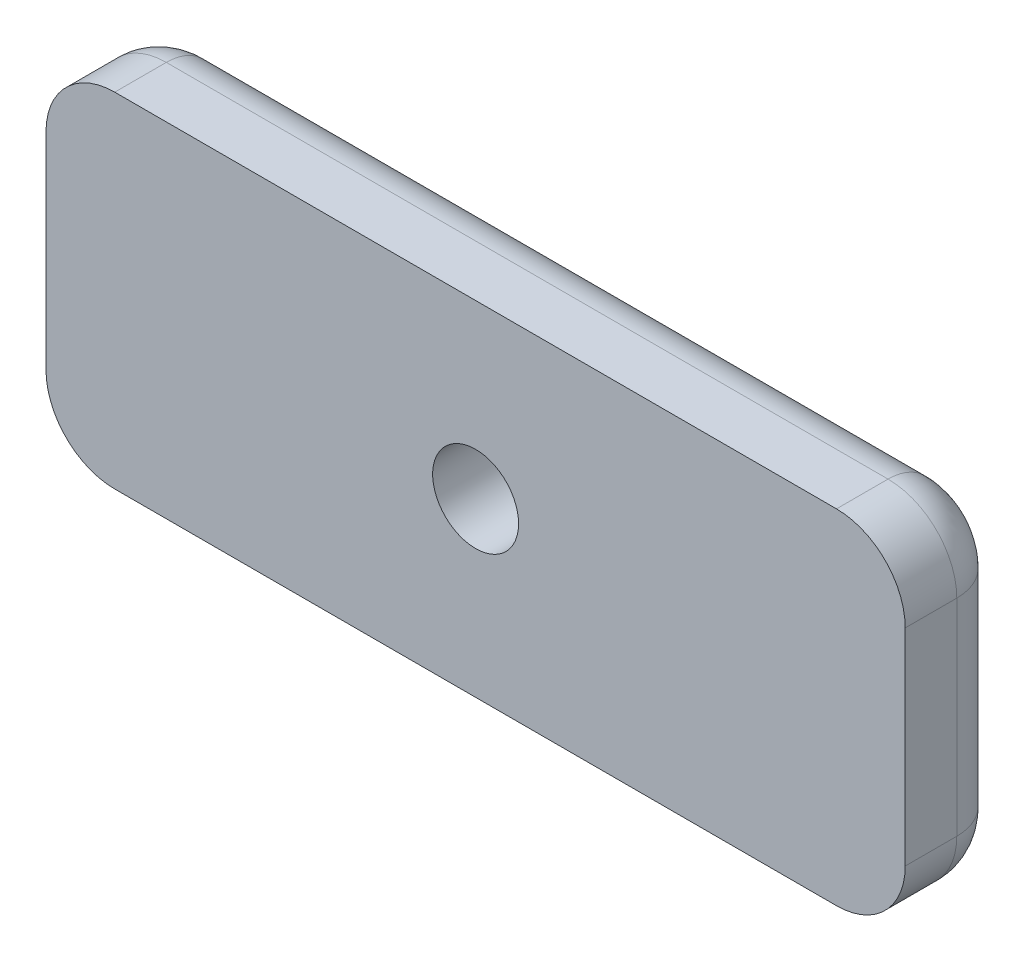
ISO-10303-21;
HEADER;
FILE_DESCRIPTION(('STEP AP214'),'2;1');
FILE_NAME('part.step','',(''),(''),'','','');
FILE_SCHEMA(('AUTOMOTIVE_DESIGN { 1 0 10303 214 1 1 1 1 }'));
ENDSEC;
DATA;
#1=APPLICATION_CONTEXT('core data for automotive mechanical design processes');
#2=APPLICATION_PROTOCOL_DEFINITION('international standard','automotive_design',2000,#1);
#3=PRODUCT_CONTEXT('',#1,'mechanical');
#4=PRODUCT('Part','Part','',(#3));
#5=PRODUCT_RELATED_PRODUCT_CATEGORY('part','',(#4));
#6=PRODUCT_DEFINITION_FORMATION('','',#4);
#7=PRODUCT_DEFINITION_CONTEXT('part definition',#1,'design');
#8=PRODUCT_DEFINITION('design','',#6,#7);
#9=PRODUCT_DEFINITION_SHAPE('','',#8);
#10=(LENGTH_UNIT() NAMED_UNIT(*) SI_UNIT(.MILLI.,.METRE.));
#11=(NAMED_UNIT(*) PLANE_ANGLE_UNIT() SI_UNIT($,.RADIAN.));
#12=(NAMED_UNIT(*) SI_UNIT($,.STERADIAN.) SOLID_ANGLE_UNIT());
#13=UNCERTAINTY_MEASURE_WITH_UNIT(LENGTH_MEASURE(1.E-05),#10,'distance_accuracy_value','');
#14=(GEOMETRIC_REPRESENTATION_CONTEXT(3) GLOBAL_UNCERTAINTY_ASSIGNED_CONTEXT((#13)) GLOBAL_UNIT_ASSIGNED_CONTEXT((#10,
#11,#12)) REPRESENTATION_CONTEXT('',''));
#15=CARTESIAN_POINT('',(0.,0.,0.));
#16=DIRECTION('',(0.,0.,1.));
#17=DIRECTION('',(1.,0.,0.));
#18=AXIS2_PLACEMENT_3D('',#15,#16,#17);
#19=CARTESIAN_POINT('',(21.,7.58418091123838,6.));
#20=DIRECTION('',(0.,0.,-1.));
#21=DIRECTION('',(-1.,0.,0.));
#22=AXIS2_PLACEMENT_3D('',#19,#20,#21);
#23=PLANE('',#22);
#24=CARTESIAN_POINT('',(21.,7.58418091123838,6.));
#25=DIRECTION('',(0.,0.,1.));
#26=DIRECTION('',(-1.,0.,0.));
#27=AXIS2_PLACEMENT_3D('',#24,#25,#26);
#28=CIRCLE('',#27,4.);
#29=CARTESIAN_POINT('',(25.,7.58418091123838,6.));
#30=VERTEX_POINT('',#29);
#31=CARTESIAN_POINT('',(21.,11.5841809112384,6.));
#32=VERTEX_POINT('',#31);
#33=EDGE_CURVE('E137',#30,#32,#28,.T.);
#34=ORIENTED_EDGE('',*,*,#33,.T.);
#35=DIRECTION('',(-1.,0.,0.));
#36=VECTOR('',#35,1.);
#37=CARTESIAN_POINT('',(-21.,11.5841809112384,6.));
#38=LINE('',#37,#36);
#39=CARTESIAN_POINT('',(-21.,11.5841809112384,6.));
#40=VERTEX_POINT('',#39);
#41=EDGE_CURVE('E127',#32,#40,#38,.T.);
#42=ORIENTED_EDGE('',*,*,#41,.T.);
#43=CARTESIAN_POINT('',(-21.,7.58418091123838,6.));
#44=DIRECTION('',(0.,0.,1.));
#45=DIRECTION('',(1.,0.,0.));
#46=AXIS2_PLACEMENT_3D('',#43,#44,#45);
#47=CIRCLE('',#46,4.);
#48=CARTESIAN_POINT('',(-25.,7.58418091123838,6.));
#49=VERTEX_POINT('',#48);
#50=EDGE_CURVE('E136',#40,#49,#47,.T.);
#51=ORIENTED_EDGE('',*,*,#50,.T.);
#52=DIRECTION('',(0.,-1.,0.));
#53=VECTOR('',#52,1.);
#54=CARTESIAN_POINT('',(-25.,7.58418091123838,6.));
#55=LINE('',#54,#53);
#56=CARTESIAN_POINT('',(-25.,-4.41581908876162,6.));
#57=VERTEX_POINT('',#56);
#58=EDGE_CURVE('E216',#49,#57,#55,.T.);
#59=ORIENTED_EDGE('',*,*,#58,.T.);
#60=CARTESIAN_POINT('',(-21.,-4.41581908876162,6.));
#61=DIRECTION('',(0.,0.,1.));
#62=DIRECTION('',(1.,0.,0.));
#63=AXIS2_PLACEMENT_3D('',#60,#61,#62);
#64=CIRCLE('',#63,4.);
#65=CARTESIAN_POINT('',(-21.,-8.41581908876162,6.));
#66=VERTEX_POINT('',#65);
#67=EDGE_CURVE('E218',#57,#66,#64,.T.);
#68=ORIENTED_EDGE('',*,*,#67,.T.);
#69=DIRECTION('',(1.,0.,0.));
#70=VECTOR('',#69,1.);
#71=CARTESIAN_POINT('',(-21.,-8.41581908876162,6.));
#72=LINE('',#71,#70);
#73=CARTESIAN_POINT('',(21.,-8.41581908876162,6.));
#74=VERTEX_POINT('',#73);
#75=EDGE_CURVE('E220',#66,#74,#72,.T.);
#76=ORIENTED_EDGE('',*,*,#75,.T.);
#77=CARTESIAN_POINT('',(21.,-4.41581908876162,6.));
#78=DIRECTION('',(0.,0.,1.));
#79=DIRECTION('',(1.,0.,0.));
#80=AXIS2_PLACEMENT_3D('',#77,#78,#79);
#81=CIRCLE('',#80,4.);
#82=CARTESIAN_POINT('',(25.,-4.41581908876162,6.));
#83=VERTEX_POINT('',#82);
#84=EDGE_CURVE('E222',#74,#83,#81,.T.);
#85=ORIENTED_EDGE('',*,*,#84,.T.);
#86=DIRECTION('',(0.,1.,0.));
#87=VECTOR('',#86,1.);
#88=CARTESIAN_POINT('',(25.,7.58418091123838,6.));
#89=LINE('',#88,#87);
#90=EDGE_CURVE('E142',#83,#30,#89,.T.);
#91=ORIENTED_EDGE('',*,*,#90,.T.);
#92=EDGE_LOOP('',(#34,#42,#51,#59,#68,#76,#85,#91));
#93=FACE_BOUND('',#92,.T.);
#94=CARTESIAN_POINT('',(0.,1.58418091123838,6.));
#95=DIRECTION('',(0.,0.,1.));
#96=DIRECTION('',(1.,0.,0.));
#97=AXIS2_PLACEMENT_3D('',#94,#95,#96);
#98=CIRCLE('',#97,2.5);
#99=CARTESIAN_POINT('',(2.50000000000004,1.58418091123838,6.));
#100=VERTEX_POINT('',#99);
#101=EDGE_CURVE('E143',#100,#100,#98,.T.);
#102=ORIENTED_EDGE('',*,*,#101,.F.);
#103=EDGE_LOOP('',(#102));
#104=FACE_BOUND('',#103,.T.);
#105=ADVANCED_FACE('F37',(#93,#104),#23,.F.);
#106=CARTESIAN_POINT('',(21.,7.58418091123838,0.));
#107=DIRECTION('',(0.,0.,-1.));
#108=DIRECTION('',(-1.,0.,0.));
#109=AXIS2_PLACEMENT_3D('',#106,#107,#108);
#110=PLANE('',#109);
#111=DIRECTION('',(0.,1.,0.));
#112=VECTOR('',#111,1.);
#113=CARTESIAN_POINT('',(22.,-4.41581908876162,0.));
#114=LINE('',#113,#112);
#115=CARTESIAN_POINT('',(22.,7.58418091123838,0.));
#116=VERTEX_POINT('',#115);
#117=CARTESIAN_POINT('',(22.,-4.41581908876162,0.));
#118=VERTEX_POINT('',#117);
#119=EDGE_CURVE('E149',#116,#118,#114,.F.);
#120=ORIENTED_EDGE('',*,*,#119,.T.);
#121=CARTESIAN_POINT('',(21.,-4.41581908876162,0.));
#122=DIRECTION('',(0.,0.,-1.));
#123=DIRECTION('',(-1.,0.,0.));
#124=AXIS2_PLACEMENT_3D('',#121,#122,#123);
#125=CIRCLE('',#124,1.);
#126=CARTESIAN_POINT('',(21.,-5.41581908876162,0.));
#127=VERTEX_POINT('',#126);
#128=EDGE_CURVE('E168',#118,#127,#125,.T.);
#129=ORIENTED_EDGE('',*,*,#128,.T.);
#130=DIRECTION('',(1.,0.,0.));
#131=VECTOR('',#130,1.);
#132=CARTESIAN_POINT('',(-21.,-5.41581908876162,0.));
#133=LINE('',#132,#131);
#134=CARTESIAN_POINT('',(-21.,-5.41581908876162,0.));
#135=VERTEX_POINT('',#134);
#136=EDGE_CURVE('E166',#127,#135,#133,.F.);
#137=ORIENTED_EDGE('',*,*,#136,.T.);
#138=CARTESIAN_POINT('',(-21.,-4.41581908876162,0.));
#139=DIRECTION('',(0.,0.,-1.));
#140=DIRECTION('',(-1.,0.,0.));
#141=AXIS2_PLACEMENT_3D('',#138,#139,#140);
#142=CIRCLE('',#141,1.);
#143=CARTESIAN_POINT('',(-22.,-4.41581908876162,0.));
#144=VERTEX_POINT('',#143);
#145=EDGE_CURVE('E164',#135,#144,#142,.T.);
#146=ORIENTED_EDGE('',*,*,#145,.T.);
#147=DIRECTION('',(0.,-1.,0.));
#148=VECTOR('',#147,1.);
#149=CARTESIAN_POINT('',(-22.,7.58418091123838,0.));
#150=LINE('',#149,#148);
#151=CARTESIAN_POINT('',(-22.,7.58418091123838,0.));
#152=VERTEX_POINT('',#151);
#153=EDGE_CURVE('E162',#144,#152,#150,.F.);
#154=ORIENTED_EDGE('',*,*,#153,.T.);
#155=CARTESIAN_POINT('',(-21.,7.58418091123838,0.));
#156=DIRECTION('',(0.,0.,-1.));
#157=DIRECTION('',(-1.,0.,0.));
#158=AXIS2_PLACEMENT_3D('',#155,#156,#157);
#159=CIRCLE('',#158,0.999999999999999);
#160=CARTESIAN_POINT('',(-21.,8.58418091123838,0.));
#161=VERTEX_POINT('',#160);
#162=EDGE_CURVE('E160',#152,#161,#159,.T.);
#163=ORIENTED_EDGE('',*,*,#162,.T.);
#164=DIRECTION('',(-1.,0.,0.));
#165=VECTOR('',#164,1.);
#166=CARTESIAN_POINT('',(21.,8.58418091123838,0.));
#167=LINE('',#166,#165);
#168=CARTESIAN_POINT('',(21.,8.58418091123838,0.));
#169=VERTEX_POINT('',#168);
#170=EDGE_CURVE('E158',#161,#169,#167,.F.);
#171=ORIENTED_EDGE('',*,*,#170,.T.);
#172=CARTESIAN_POINT('',(21.,7.58418091123838,0.));
#173=DIRECTION('',(0.,0.,-1.));
#174=DIRECTION('',(-1.,0.,0.));
#175=AXIS2_PLACEMENT_3D('',#172,#173,#174);
#176=CIRCLE('',#175,0.999999999999998);
#177=EDGE_CURVE('E156',#169,#116,#176,.T.);
#178=ORIENTED_EDGE('',*,*,#177,.T.);
#179=EDGE_LOOP('',(#120,#129,#137,#146,#154,#163,#171,#178));
#180=FACE_BOUND('',#179,.T.);
#181=CARTESIAN_POINT('',(0.,1.58418091123838,0.));
#182=DIRECTION('',(0.,0.,1.));
#183=DIRECTION('',(1.,0.,0.));
#184=AXIS2_PLACEMENT_3D('',#181,#182,#183);
#185=CIRCLE('',#184,2.5);
#186=CARTESIAN_POINT('',(2.50000000000004,1.58418091123838,0.));
#187=VERTEX_POINT('',#186);
#188=EDGE_CURVE('E203',#187,#187,#185,.T.);
#189=ORIENTED_EDGE('',*,*,#188,.T.);
#190=EDGE_LOOP('',(#189));
#191=FACE_BOUND('',#190,.T.);
#192=ADVANCED_FACE('F275',(#180,#191),#110,.T.);
#193=CARTESIAN_POINT('',(21.,7.58418091123838,6.));
#194=DIRECTION('',(0.,0.,-1.));
#195=DIRECTION('',(-1.,0.,0.));
#196=AXIS2_PLACEMENT_3D('',#193,#194,#195);
#197=CYLINDRICAL_SURFACE('',#196,4.);
#198=DIRECTION('',(0.,0.,-1.));
#199=VECTOR('',#198,1.);
#200=CARTESIAN_POINT('',(25.,7.58418091123838,6.));
#201=LINE('',#200,#199);
#202=CARTESIAN_POINT('',(25.,7.58418091123838,3.));
#203=VERTEX_POINT('',#202);
#204=EDGE_CURVE('E225',#30,#203,#201,.T.);
#205=ORIENTED_EDGE('',*,*,#204,.T.);
#206=CARTESIAN_POINT('',(21.,7.58418091123838,3.));
#207=DIRECTION('',(0.,0.,-1.));
#208=DIRECTION('',(-1.,0.,0.));
#209=AXIS2_PLACEMENT_3D('',#206,#207,#208);
#210=CIRCLE('',#209,4.);
#211=CARTESIAN_POINT('',(21.,11.5841809112384,3.));
#212=VERTEX_POINT('',#211);
#213=EDGE_CURVE('E46',#203,#212,#210,.F.);
#214=ORIENTED_EDGE('',*,*,#213,.T.);
#215=DIRECTION('',(0.,0.,-1.));
#216=VECTOR('',#215,1.);
#217=CARTESIAN_POINT('',(21.,11.5841809112384,6.));
#218=LINE('',#217,#216);
#219=EDGE_CURVE('E130',#32,#212,#218,.T.);
#220=ORIENTED_EDGE('',*,*,#219,.F.);
#221=ORIENTED_EDGE('',*,*,#33,.F.);
#222=EDGE_LOOP('',(#205,#214,#220,#221));
#223=FACE_BOUND('',#222,.T.);
#224=ADVANCED_FACE('F145',(#223),#197,.T.);
#225=CARTESIAN_POINT('',(-21.,11.5841809112384,6.));
#226=DIRECTION('',(0.,-1.,0.));
#227=DIRECTION('',(1.,0.,0.));
#228=AXIS2_PLACEMENT_3D('',#225,#226,#227);
#229=PLANE('',#228);
#230=ORIENTED_EDGE('',*,*,#219,.T.);
#231=DIRECTION('',(-1.,0.,0.));
#232=VECTOR('',#231,1.);
#233=CARTESIAN_POINT('',(-21.,11.5841809112384,3.));
#234=LINE('',#233,#232);
#235=CARTESIAN_POINT('',(-21.,11.5841809112384,3.));
#236=VERTEX_POINT('',#235);
#237=EDGE_CURVE('E179',#212,#236,#234,.T.);
#238=ORIENTED_EDGE('',*,*,#237,.T.);
#239=DIRECTION('',(0.,0.,-1.));
#240=VECTOR('',#239,1.);
#241=CARTESIAN_POINT('',(-21.,11.5841809112384,6.));
#242=LINE('',#241,#240);
#243=EDGE_CURVE('E133',#40,#236,#242,.T.);
#244=ORIENTED_EDGE('',*,*,#243,.F.);
#245=ORIENTED_EDGE('',*,*,#41,.F.);
#246=EDGE_LOOP('',(#230,#238,#244,#245));
#247=FACE_BOUND('',#246,.T.);
#248=ADVANCED_FACE('F129',(#247),#229,.F.);
#249=CARTESIAN_POINT('',(-21.,7.58418091123838,6.));
#250=DIRECTION('',(0.,0.,-1.));
#251=DIRECTION('',(-1.,0.,0.));
#252=AXIS2_PLACEMENT_3D('',#249,#250,#251);
#253=CYLINDRICAL_SURFACE('',#252,4.);
#254=ORIENTED_EDGE('',*,*,#243,.T.);
#255=CARTESIAN_POINT('',(-21.,7.58418091123838,3.));
#256=DIRECTION('',(0.,0.,-1.));
#257=DIRECTION('',(-1.,0.,0.));
#258=AXIS2_PLACEMENT_3D('',#255,#256,#257);
#259=CIRCLE('',#258,4.);
#260=CARTESIAN_POINT('',(-25.,7.58418091123838,3.));
#261=VERTEX_POINT('',#260);
#262=EDGE_CURVE('E177',#236,#261,#259,.F.);
#263=ORIENTED_EDGE('',*,*,#262,.T.);
#264=DIRECTION('',(0.,0.,-1.));
#265=VECTOR('',#264,1.);
#266=CARTESIAN_POINT('',(-25.,7.58418091123838,6.));
#267=LINE('',#266,#265);
#268=EDGE_CURVE('E151',#49,#261,#267,.T.);
#269=ORIENTED_EDGE('',*,*,#268,.F.);
#270=ORIENTED_EDGE('',*,*,#50,.F.);
#271=EDGE_LOOP('',(#254,#263,#269,#270));
#272=FACE_BOUND('',#271,.T.);
#273=ADVANCED_FACE('F265',(#272),#253,.T.);
#274=CARTESIAN_POINT('',(-25.,7.58418091123838,6.));
#275=DIRECTION('',(1.,0.,0.));
#276=DIRECTION('',(0.,0.,-1.));
#277=AXIS2_PLACEMENT_3D('',#274,#275,#276);
#278=PLANE('',#277);
#279=ORIENTED_EDGE('',*,*,#268,.T.);
#280=DIRECTION('',(0.,-1.,0.));
#281=VECTOR('',#280,1.);
#282=CARTESIAN_POINT('',(-25.,-4.41581908876162,3.));
#283=LINE('',#282,#281);
#284=CARTESIAN_POINT('',(-25.,-4.41581908876162,3.));
#285=VERTEX_POINT('',#284);
#286=EDGE_CURVE('E175',#261,#285,#283,.T.);
#287=ORIENTED_EDGE('',*,*,#286,.T.);
#288=DIRECTION('',(0.,0.,-1.));
#289=VECTOR('',#288,1.);
#290=CARTESIAN_POINT('',(-25.,-4.41581908876162,6.));
#291=LINE('',#290,#289);
#292=EDGE_CURVE('E235',#57,#285,#291,.T.);
#293=ORIENTED_EDGE('',*,*,#292,.F.);
#294=ORIENTED_EDGE('',*,*,#58,.F.);
#295=EDGE_LOOP('',(#279,#287,#293,#294));
#296=FACE_BOUND('',#295,.T.);
#297=ADVANCED_FACE('F241',(#296),#278,.F.);
#298=CARTESIAN_POINT('',(-21.,-4.41581908876162,6.));
#299=DIRECTION('',(0.,0.,-1.));
#300=DIRECTION('',(-1.,0.,0.));
#301=AXIS2_PLACEMENT_3D('',#298,#299,#300);
#302=CYLINDRICAL_SURFACE('',#301,4.);
#303=ORIENTED_EDGE('',*,*,#292,.T.);
#304=CARTESIAN_POINT('',(-21.,-4.41581908876162,3.));
#305=DIRECTION('',(0.,0.,-1.));
#306=DIRECTION('',(-1.,0.,0.));
#307=AXIS2_PLACEMENT_3D('',#304,#305,#306);
#308=CIRCLE('',#307,4.);
#309=CARTESIAN_POINT('',(-21.,-8.41581908876162,3.));
#310=VERTEX_POINT('',#309);
#311=EDGE_CURVE('E173',#285,#310,#308,.F.);
#312=ORIENTED_EDGE('',*,*,#311,.T.);
#313=DIRECTION('',(0.,0.,-1.));
#314=VECTOR('',#313,1.);
#315=CARTESIAN_POINT('',(-21.,-8.41581908876162,6.));
#316=LINE('',#315,#314);
#317=EDGE_CURVE('E232',#66,#310,#316,.T.);
#318=ORIENTED_EDGE('',*,*,#317,.F.);
#319=ORIENTED_EDGE('',*,*,#67,.F.);
#320=EDGE_LOOP('',(#303,#312,#318,#319));
#321=FACE_BOUND('',#320,.T.);
#322=ADVANCED_FACE('F257',(#321),#302,.T.);
#323=CARTESIAN_POINT('',(-21.,-8.41581908876162,6.));
#324=DIRECTION('',(0.,1.,0.));
#325=DIRECTION('',(0.,0.,1.));
#326=AXIS2_PLACEMENT_3D('',#323,#324,#325);
#327=PLANE('',#326);
#328=ORIENTED_EDGE('',*,*,#317,.T.);
#329=DIRECTION('',(1.,0.,0.));
#330=VECTOR('',#329,1.);
#331=CARTESIAN_POINT('',(21.,-8.41581908876162,3.));
#332=LINE('',#331,#330);
#333=CARTESIAN_POINT('',(21.,-8.41581908876162,3.));
#334=VERTEX_POINT('',#333);
#335=EDGE_CURVE('E171',#310,#334,#332,.T.);
#336=ORIENTED_EDGE('',*,*,#335,.T.);
#337=DIRECTION('',(0.,0.,-1.));
#338=VECTOR('',#337,1.);
#339=CARTESIAN_POINT('',(21.,-8.41581908876162,6.));
#340=LINE('',#339,#338);
#341=EDGE_CURVE('E229',#74,#334,#340,.T.);
#342=ORIENTED_EDGE('',*,*,#341,.F.);
#343=ORIENTED_EDGE('',*,*,#75,.F.);
#344=EDGE_LOOP('',(#328,#336,#342,#343));
#345=FACE_BOUND('',#344,.T.);
#346=ADVANCED_FACE('F261',(#345),#327,.F.);
#347=CARTESIAN_POINT('',(21.,-4.41581908876162,6.));
#348=DIRECTION('',(0.,0.,-1.));
#349=DIRECTION('',(-1.,0.,0.));
#350=AXIS2_PLACEMENT_3D('',#347,#348,#349);
#351=CYLINDRICAL_SURFACE('',#350,4.);
#352=ORIENTED_EDGE('',*,*,#341,.T.);
#353=CARTESIAN_POINT('',(21.,-4.41581908876162,3.));
#354=DIRECTION('',(0.,0.,-1.));
#355=DIRECTION('',(-1.,0.,0.));
#356=AXIS2_PLACEMENT_3D('',#353,#354,#355);
#357=CIRCLE('',#356,4.);
#358=CARTESIAN_POINT('',(25.,-4.41581908876162,3.));
#359=VERTEX_POINT('',#358);
#360=EDGE_CURVE('E146',#334,#359,#357,.F.);
#361=ORIENTED_EDGE('',*,*,#360,.T.);
#362=DIRECTION('',(0.,0.,-1.));
#363=VECTOR('',#362,1.);
#364=CARTESIAN_POINT('',(25.,-4.41581908876162,6.));
#365=LINE('',#364,#363);
#366=EDGE_CURVE('E227',#83,#359,#365,.T.);
#367=ORIENTED_EDGE('',*,*,#366,.F.);
#368=ORIENTED_EDGE('',*,*,#84,.F.);
#369=EDGE_LOOP('',(#352,#361,#367,#368));
#370=FACE_BOUND('',#369,.T.);
#371=ADVANCED_FACE('F288',(#370),#351,.T.);
#372=CARTESIAN_POINT('',(25.,7.58418091123838,6.));
#373=DIRECTION('',(-1.,0.,0.));
#374=DIRECTION('',(0.,0.,1.));
#375=AXIS2_PLACEMENT_3D('',#372,#373,#374);
#376=PLANE('',#375);
#377=ORIENTED_EDGE('',*,*,#366,.T.);
#378=DIRECTION('',(0.,1.,0.));
#379=VECTOR('',#378,1.);
#380=CARTESIAN_POINT('',(25.,7.58418091123838,3.));
#381=LINE('',#380,#379);
#382=EDGE_CURVE('E11',#359,#203,#381,.T.);
#383=ORIENTED_EDGE('',*,*,#382,.T.);
#384=ORIENTED_EDGE('',*,*,#204,.F.);
#385=ORIENTED_EDGE('',*,*,#90,.F.);
#386=EDGE_LOOP('',(#377,#383,#384,#385));
#387=FACE_BOUND('',#386,.T.);
#388=ADVANCED_FACE('F285',(#387),#376,.F.);
#389=CARTESIAN_POINT('',(0.,1.58418091123838,6.));
#390=DIRECTION('',(0.,0.,-1.));
#391=DIRECTION('',(-1.,0.,0.));
#392=AXIS2_PLACEMENT_3D('',#389,#390,#391);
#393=CYLINDRICAL_SURFACE('',#392,2.5);
#394=ORIENTED_EDGE('',*,*,#101,.T.);
#395=EDGE_LOOP('',(#394));
#396=FACE_BOUND('',#395,.T.);
#397=ORIENTED_EDGE('',*,*,#188,.F.);
#398=EDGE_LOOP('',(#397));
#399=FACE_BOUND('',#398,.T.);
#400=ADVANCED_FACE('F283',(#396,#399),#393,.F.);
#401=CARTESIAN_POINT('',(-21.,7.58418091123838,3.));
#402=DIRECTION('',(0.,0.,-1.));
#403=DIRECTION('',(-1.,0.,0.));
#404=AXIS2_PLACEMENT_3D('',#401,#402,#403);
#405=DEGENERATE_TOROIDAL_SURFACE('',#404,0.999999999999999,3.,.T.);
#406=CARTESIAN_POINT('',(-21.,8.58418091123838,3.));
#407=DIRECTION('',(1.,0.,0.));
#408=DIRECTION('',(0.,0.,-1.));
#409=AXIS2_PLACEMENT_3D('',#406,#407,#408);
#410=CIRCLE('',#409,3.);
#411=EDGE_CURVE('E197',#161,#236,#410,.T.);
#412=ORIENTED_EDGE('',*,*,#411,.F.);
#413=ORIENTED_EDGE('',*,*,#162,.F.);
#414=CARTESIAN_POINT('',(-22.,7.58418091123838,3.));
#415=DIRECTION('',(0.,-1.,0.));
#416=DIRECTION('',(1.,0.,0.));
#417=AXIS2_PLACEMENT_3D('',#414,#415,#416);
#418=CIRCLE('',#417,3.);
#419=EDGE_CURVE('E41',#261,#152,#418,.T.);
#420=ORIENTED_EDGE('',*,*,#419,.F.);
#421=ORIENTED_EDGE('',*,*,#262,.F.);
#422=EDGE_LOOP('',(#412,#413,#420,#421));
#423=FACE_BOUND('',#422,.T.);
#424=ADVANCED_FACE('F39',(#423),#405,.T.);
#425=CARTESIAN_POINT('',(-22.,7.58418091123838,3.));
#426=DIRECTION('',(0.,1.,0.));
#427=DIRECTION('',(0.,0.,1.));
#428=AXIS2_PLACEMENT_3D('',#425,#426,#427);
#429=CYLINDRICAL_SURFACE('',#428,3.);
#430=ORIENTED_EDGE('',*,*,#419,.T.);
#431=ORIENTED_EDGE('',*,*,#153,.F.);
#432=CARTESIAN_POINT('',(-22.,-4.41581908876162,3.));
#433=DIRECTION('',(0.,-1.,0.));
#434=DIRECTION('',(0.,0.,-1.));
#435=AXIS2_PLACEMENT_3D('',#432,#433,#434);
#436=CIRCLE('',#435,3.);
#437=EDGE_CURVE('E195',#285,#144,#436,.T.);
#438=ORIENTED_EDGE('',*,*,#437,.F.);
#439=ORIENTED_EDGE('',*,*,#286,.F.);
#440=EDGE_LOOP('',(#430,#431,#438,#439));
#441=FACE_BOUND('',#440,.T.);
#442=ADVANCED_FACE('F248',(#441),#429,.T.);
#443=CARTESIAN_POINT('',(-21.,8.58418091123838,3.));
#444=DIRECTION('',(1.,0.,0.));
#445=DIRECTION('',(0.,1.,0.));
#446=AXIS2_PLACEMENT_3D('',#443,#444,#445);
#447=CYLINDRICAL_SURFACE('',#446,3.);
#448=ORIENTED_EDGE('',*,*,#411,.T.);
#449=ORIENTED_EDGE('',*,*,#237,.F.);
#450=CARTESIAN_POINT('',(21.,8.58418091123838,3.));
#451=DIRECTION('',(1.,0.,0.));
#452=DIRECTION('',(0.,0.,-1.));
#453=AXIS2_PLACEMENT_3D('',#450,#451,#452);
#454=CIRCLE('',#453,3.);
#455=EDGE_CURVE('E192',#169,#212,#454,.T.);
#456=ORIENTED_EDGE('',*,*,#455,.F.);
#457=ORIENTED_EDGE('',*,*,#170,.F.);
#458=EDGE_LOOP('',(#448,#449,#456,#457));
#459=FACE_BOUND('',#458,.T.);
#460=ADVANCED_FACE('F329',(#459),#447,.T.);
#461=CARTESIAN_POINT('',(-21.,-4.41581908876162,3.));
#462=DIRECTION('',(0.,0.,-1.));
#463=DIRECTION('',(-1.,0.,0.));
#464=AXIS2_PLACEMENT_3D('',#461,#462,#463);
#465=DEGENERATE_TOROIDAL_SURFACE('',#464,1.,3.,.T.);
#466=ORIENTED_EDGE('',*,*,#437,.T.);
#467=ORIENTED_EDGE('',*,*,#145,.F.);
#468=CARTESIAN_POINT('',(-21.,-5.41581908876162,3.));
#469=DIRECTION('',(1.,0.,0.));
#470=DIRECTION('',(0.,0.,-1.));
#471=AXIS2_PLACEMENT_3D('',#468,#469,#470);
#472=CIRCLE('',#471,3.);
#473=EDGE_CURVE('E189',#310,#135,#472,.T.);
#474=ORIENTED_EDGE('',*,*,#473,.F.);
#475=ORIENTED_EDGE('',*,*,#311,.F.);
#476=EDGE_LOOP('',(#466,#467,#474,#475));
#477=FACE_BOUND('',#476,.T.);
#478=ADVANCED_FACE('F253',(#477),#465,.T.);
#479=CARTESIAN_POINT('',(21.,7.58418091123838,3.));
#480=DIRECTION('',(0.,0.,-1.));
#481=DIRECTION('',(-1.,0.,0.));
#482=AXIS2_PLACEMENT_3D('',#479,#480,#481);
#483=DEGENERATE_TOROIDAL_SURFACE('',#482,0.999999999999998,3.,.T.);
#484=ORIENTED_EDGE('',*,*,#455,.T.);
#485=ORIENTED_EDGE('',*,*,#213,.F.);
#486=CARTESIAN_POINT('',(22.,7.58418091123838,3.));
#487=DIRECTION('',(0.,-1.,0.));
#488=DIRECTION('',(1.,0.,0.));
#489=AXIS2_PLACEMENT_3D('',#486,#487,#488);
#490=CIRCLE('',#489,3.);
#491=EDGE_CURVE('E186',#116,#203,#490,.T.);
#492=ORIENTED_EDGE('',*,*,#491,.F.);
#493=ORIENTED_EDGE('',*,*,#177,.F.);
#494=EDGE_LOOP('',(#484,#485,#492,#493));
#495=FACE_BOUND('',#494,.T.);
#496=ADVANCED_FACE('F341',(#495),#483,.T.);
#497=CARTESIAN_POINT('',(-21.,-5.41581908876162,3.));
#498=DIRECTION('',(-1.,0.,0.));
#499=DIRECTION('',(0.,0.,1.));
#500=AXIS2_PLACEMENT_3D('',#497,#498,#499);
#501=CYLINDRICAL_SURFACE('',#500,3.);
#502=ORIENTED_EDGE('',*,*,#473,.T.);
#503=ORIENTED_EDGE('',*,*,#136,.F.);
#504=CARTESIAN_POINT('',(21.,-5.41581908876162,3.));
#505=DIRECTION('',(1.,0.,0.));
#506=DIRECTION('',(0.,0.,-1.));
#507=AXIS2_PLACEMENT_3D('',#504,#505,#506);
#508=CIRCLE('',#507,3.);
#509=EDGE_CURVE('E184',#334,#127,#508,.T.);
#510=ORIENTED_EDGE('',*,*,#509,.F.);
#511=ORIENTED_EDGE('',*,*,#335,.F.);
#512=EDGE_LOOP('',(#502,#503,#510,#511));
#513=FACE_BOUND('',#512,.T.);
#514=ADVANCED_FACE('F348',(#513),#501,.T.);
#515=CARTESIAN_POINT('',(22.,7.58418091123838,3.));
#516=DIRECTION('',(0.,-1.,0.));
#517=DIRECTION('',(0.,0.,-1.));
#518=AXIS2_PLACEMENT_3D('',#515,#516,#517);
#519=CYLINDRICAL_SURFACE('',#518,3.);
#520=ORIENTED_EDGE('',*,*,#491,.T.);
#521=ORIENTED_EDGE('',*,*,#382,.F.);
#522=CARTESIAN_POINT('',(22.,-4.41581908876162,3.));
#523=DIRECTION('',(0.,-1.,0.));
#524=DIRECTION('',(0.,0.,-1.));
#525=AXIS2_PLACEMENT_3D('',#522,#523,#524);
#526=CIRCLE('',#525,3.);
#527=EDGE_CURVE('E182',#118,#359,#526,.T.);
#528=ORIENTED_EDGE('',*,*,#527,.F.);
#529=ORIENTED_EDGE('',*,*,#119,.F.);
#530=EDGE_LOOP('',(#520,#521,#528,#529));
#531=FACE_BOUND('',#530,.T.);
#532=ADVANCED_FACE('F356',(#531),#519,.T.);
#533=CARTESIAN_POINT('',(21.,-4.41581908876162,3.));
#534=DIRECTION('',(0.,0.,-1.));
#535=DIRECTION('',(-1.,0.,0.));
#536=AXIS2_PLACEMENT_3D('',#533,#534,#535);
#537=DEGENERATE_TOROIDAL_SURFACE('',#536,1.,3.,.T.);
#538=ORIENTED_EDGE('',*,*,#509,.T.);
#539=ORIENTED_EDGE('',*,*,#128,.F.);
#540=ORIENTED_EDGE('',*,*,#527,.T.);
#541=ORIENTED_EDGE('',*,*,#360,.F.);
#542=EDGE_LOOP('',(#538,#539,#540,#541));
#543=FACE_BOUND('',#542,.T.);
#544=ADVANCED_FACE('F364',(#543),#537,.T.);
#545=CLOSED_SHELL('',(#105,#192,#224,#248,#273,#297,#322,#346,#371,#388,#400,#424,#442,#460,
#478,#496,#514,#532,#544));
#546=MANIFOLD_SOLID_BREP('B2',#545);
#547=ADVANCED_BREP_SHAPE_REPRESENTATION('',(#18,#546),#14);
#548=SHAPE_DEFINITION_REPRESENTATION(#9,#547);
ENDSEC;
END-ISO-10303-21;
